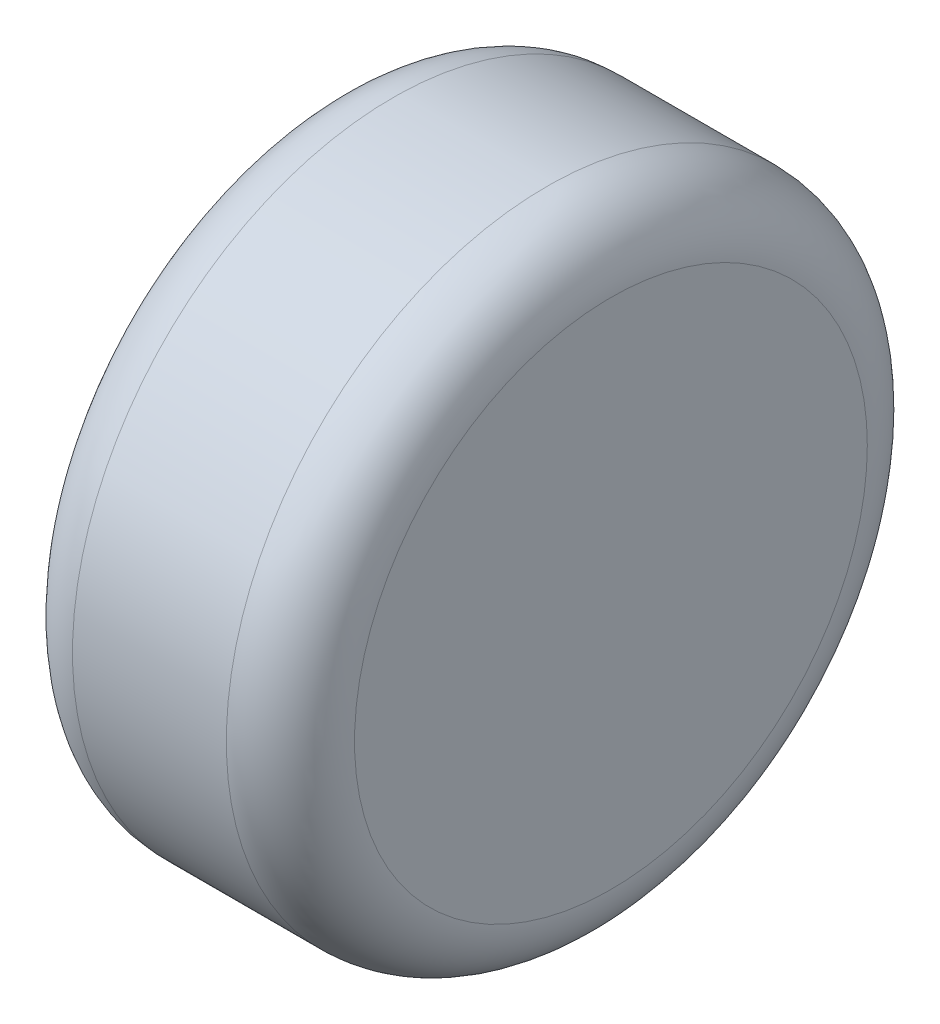
ISO-10303-21;
HEADER;
FILE_DESCRIPTION(('STEP AP214'),'2;1');
FILE_NAME('part.step','',(''),(''),'','','');
FILE_SCHEMA(('AUTOMOTIVE_DESIGN { 1 0 10303 214 1 1 1 1 }'));
ENDSEC;
DATA;
#1=APPLICATION_CONTEXT('core data for automotive mechanical design processes');
#2=APPLICATION_PROTOCOL_DEFINITION('international standard','automotive_design',2000,#1);
#3=PRODUCT_CONTEXT('',#1,'mechanical');
#4=PRODUCT('Part','Part','',(#3));
#5=PRODUCT_RELATED_PRODUCT_CATEGORY('part','',(#4));
#6=PRODUCT_DEFINITION_FORMATION('','',#4);
#7=PRODUCT_DEFINITION_CONTEXT('part definition',#1,'design');
#8=PRODUCT_DEFINITION('design','',#6,#7);
#9=PRODUCT_DEFINITION_SHAPE('','',#8);
#10=(LENGTH_UNIT() NAMED_UNIT(*) SI_UNIT(.MILLI.,.METRE.));
#11=(NAMED_UNIT(*) PLANE_ANGLE_UNIT() SI_UNIT($,.RADIAN.));
#12=(NAMED_UNIT(*) SI_UNIT($,.STERADIAN.) SOLID_ANGLE_UNIT());
#13=UNCERTAINTY_MEASURE_WITH_UNIT(LENGTH_MEASURE(1.E-05),#10,'distance_accuracy_value','');
#14=(GEOMETRIC_REPRESENTATION_CONTEXT(3) GLOBAL_UNCERTAINTY_ASSIGNED_CONTEXT((#13)) GLOBAL_UNIT_ASSIGNED_CONTEXT((#10,
#11,#12)) REPRESENTATION_CONTEXT('',''));
#15=CARTESIAN_POINT('',(0.,0.,0.));
#16=DIRECTION('',(0.,0.,1.));
#17=DIRECTION('',(1.,0.,0.));
#18=AXIS2_PLACEMENT_3D('',#15,#16,#17);
#19=CARTESIAN_POINT('',(55.88,0.,0.));
#20=DIRECTION('',(-1.,0.,0.));
#21=DIRECTION('',(0.,0.,1.));
#22=AXIS2_PLACEMENT_3D('',#19,#20,#21);
#23=CYLINDRICAL_SURFACE('',#22,63.5);
#24=CARTESIAN_POINT('',(43.18,0.,0.));
#25=DIRECTION('',(1.,0.,0.));
#26=DIRECTION('',(0.,0.,-1.));
#27=AXIS2_PLACEMENT_3D('',#24,#25,#26);
#28=CIRCLE('',#27,63.5);
#29=CARTESIAN_POINT('',(43.18,0.,-63.5));
#30=VERTEX_POINT('',#29);
#31=EDGE_CURVE('E39',#30,#30,#28,.F.);
#32=ORIENTED_EDGE('',*,*,#31,.T.);
#33=EDGE_LOOP('',(#32));
#34=FACE_BOUND('',#33,.T.);
#35=CARTESIAN_POINT('',(12.7,0.,0.));
#36=DIRECTION('',(1.,0.,0.));
#37=DIRECTION('',(0.,0.,-1.));
#38=AXIS2_PLACEMENT_3D('',#35,#36,#37);
#39=CIRCLE('',#38,63.5);
#40=CARTESIAN_POINT('',(12.7,0.,-63.5));
#41=VERTEX_POINT('',#40);
#42=EDGE_CURVE('E43',#41,#41,#39,.T.);
#43=ORIENTED_EDGE('',*,*,#42,.T.);
#44=EDGE_LOOP('',(#43));
#45=FACE_BOUND('',#44,.T.);
#46=ADVANCED_FACE('F32',(#34,#45),#23,.T.);
#47=CARTESIAN_POINT('',(55.88,0.,0.));
#48=DIRECTION('',(1.,0.,0.));
#49=DIRECTION('',(0.,0.,-1.));
#50=AXIS2_PLACEMENT_3D('',#47,#48,#49);
#51=PLANE('',#50);
#52=CARTESIAN_POINT('',(55.88,0.,0.));
#53=DIRECTION('',(1.,0.,0.));
#54=DIRECTION('',(0.,0.,-1.));
#55=AXIS2_PLACEMENT_3D('',#52,#53,#54);
#56=CIRCLE('',#55,50.8);
#57=CARTESIAN_POINT('',(55.88,0.,-50.8));
#58=VERTEX_POINT('',#57);
#59=EDGE_CURVE('E47',#58,#58,#56,.T.);
#60=ORIENTED_EDGE('',*,*,#59,.T.);
#61=EDGE_LOOP('',(#60));
#62=FACE_BOUND('',#61,.T.);
#63=ADVANCED_FACE('F53',(#62),#51,.T.);
#64=CARTESIAN_POINT('',(0.,0.,0.));
#65=DIRECTION('',(1.,0.,0.));
#66=DIRECTION('',(0.,0.,-1.));
#67=AXIS2_PLACEMENT_3D('',#64,#65,#66);
#68=PLANE('',#67);
#69=CARTESIAN_POINT('',(0.,0.,0.));
#70=DIRECTION('',(1.,0.,0.));
#71=DIRECTION('',(0.,0.,-1.));
#72=AXIS2_PLACEMENT_3D('',#69,#70,#71);
#73=CIRCLE('',#72,50.8);
#74=CARTESIAN_POINT('',(0.,0.,-50.8));
#75=VERTEX_POINT('',#74);
#76=EDGE_CURVE('E10',#75,#75,#73,.F.);
#77=ORIENTED_EDGE('',*,*,#76,.T.);
#78=EDGE_LOOP('',(#77));
#79=FACE_BOUND('',#78,.T.);
#80=ADVANCED_FACE('F57',(#79),#68,.F.);
#81=CARTESIAN_POINT('',(43.18,0.,0.));
#82=DIRECTION('',(1.,0.,0.));
#83=DIRECTION('',(0.,0.,-1.));
#84=AXIS2_PLACEMENT_3D('',#81,#82,#83);
#85=TOROIDAL_SURFACE('',#84,50.8,12.7);
#86=ORIENTED_EDGE('',*,*,#31,.F.);
#87=EDGE_LOOP('',(#86));
#88=FACE_BOUND('',#87,.T.);
#89=ORIENTED_EDGE('',*,*,#59,.F.);
#90=EDGE_LOOP('',(#89));
#91=FACE_BOUND('',#90,.T.);
#92=ADVANCED_FACE('F55',(#88,#91),#85,.T.);
#93=CARTESIAN_POINT('',(12.7,0.,0.));
#94=DIRECTION('',(1.,0.,0.));
#95=DIRECTION('',(0.,0.,-1.));
#96=AXIS2_PLACEMENT_3D('',#93,#94,#95);
#97=TOROIDAL_SURFACE('',#96,50.8,12.7);
#98=ORIENTED_EDGE('',*,*,#76,.F.);
#99=EDGE_LOOP('',(#98));
#100=FACE_BOUND('',#99,.T.);
#101=ORIENTED_EDGE('',*,*,#42,.F.);
#102=EDGE_LOOP('',(#101));
#103=FACE_BOUND('',#102,.T.);
#104=ADVANCED_FACE('F34',(#100,#103),#97,.T.);
#105=CLOSED_SHELL('',(#46,#63,#80,#92,#104));
#106=MANIFOLD_SOLID_BREP('B2',#105);
#107=ADVANCED_BREP_SHAPE_REPRESENTATION('',(#18,#106),#14);
#108=SHAPE_DEFINITION_REPRESENTATION(#9,#107);
ENDSEC;
END-ISO-10303-21;
